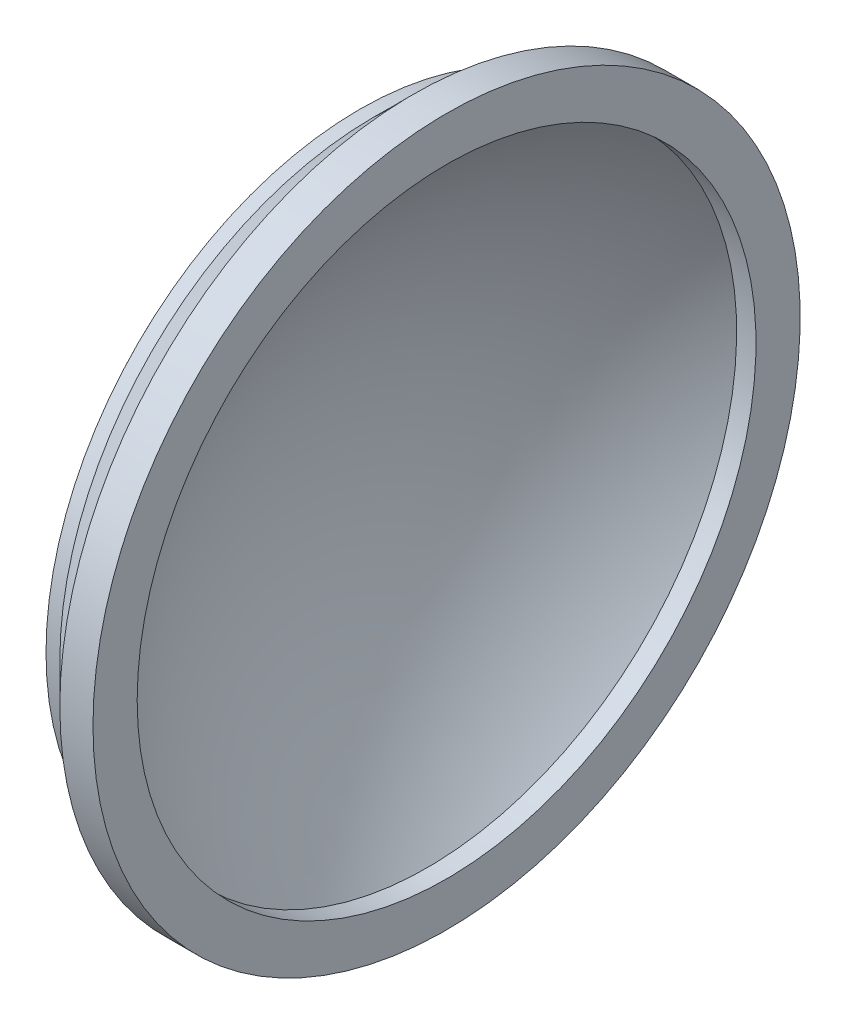
ISO-10303-21;
HEADER;
FILE_DESCRIPTION(('STEP AP214'),'2;1');
FILE_NAME('part.step','',(''),(''),'','','');
FILE_SCHEMA(('AUTOMOTIVE_DESIGN { 1 0 10303 214 1 1 1 1 }'));
ENDSEC;
DATA;
#1=APPLICATION_CONTEXT('core data for automotive mechanical design processes');
#2=APPLICATION_PROTOCOL_DEFINITION('international standard','automotive_design',2000,#1);
#3=PRODUCT_CONTEXT('',#1,'mechanical');
#4=PRODUCT('Part','Part','',(#3));
#5=PRODUCT_RELATED_PRODUCT_CATEGORY('part','',(#4));
#6=PRODUCT_DEFINITION_FORMATION('','',#4);
#7=PRODUCT_DEFINITION_CONTEXT('part definition',#1,'design');
#8=PRODUCT_DEFINITION('design','',#6,#7);
#9=PRODUCT_DEFINITION_SHAPE('','',#8);
#10=(LENGTH_UNIT() NAMED_UNIT(*) SI_UNIT(.MILLI.,.METRE.));
#11=(NAMED_UNIT(*) PLANE_ANGLE_UNIT() SI_UNIT($,.RADIAN.));
#12=(NAMED_UNIT(*) SI_UNIT($,.STERADIAN.) SOLID_ANGLE_UNIT());
#13=UNCERTAINTY_MEASURE_WITH_UNIT(LENGTH_MEASURE(1.E-05),#10,'distance_accuracy_value','');
#14=(GEOMETRIC_REPRESENTATION_CONTEXT(3) GLOBAL_UNCERTAINTY_ASSIGNED_CONTEXT((#13)) GLOBAL_UNIT_ASSIGNED_CONTEXT((#10,
#11,#12)) REPRESENTATION_CONTEXT('',''));
#15=CARTESIAN_POINT('',(0.,0.,0.));
#16=DIRECTION('',(0.,0.,1.));
#17=DIRECTION('',(1.,0.,0.));
#18=AXIS2_PLACEMENT_3D('',#15,#16,#17);
#19=CARTESIAN_POINT('',(44.4444055073609,0.,0.));
#20=DIRECTION('',(-1.,0.,0.));
#21=DIRECTION('',(0.,1.,0.));
#22=AXIS2_PLACEMENT_3D('',#19,#20,#21);
#23=SPHERICAL_SURFACE('',#22,95.);
#24=CARTESIAN_POINT('',(-31.7203851914246,0.,0.));
#25=DIRECTION('',(-1.,0.,0.));
#26=DIRECTION('',(0.,0.,1.));
#27=AXIS2_PLACEMENT_3D('',#24,#25,#26);
#28=CIRCLE('',#27,56.7796148085753);
#29=CARTESIAN_POINT('',(-31.7203851914246,0.,56.7796148085753));
#30=VERTEX_POINT('',#29);
#31=EDGE_CURVE('E68',#30,#30,#28,.T.);
#32=ORIENTED_EDGE('',*,*,#31,.T.);
#33=EDGE_LOOP('',(#32));
#34=FACE_BOUND('',#33,.T.);
#35=ADVANCED_FACE('F41',(#34),#23,.T.);
#36=CARTESIAN_POINT('',(44.4444055073609,0.,0.));
#37=DIRECTION('',(-1.,0.,0.));
#38=DIRECTION('',(0.,1.,0.));
#39=AXIS2_PLACEMENT_3D('',#36,#37,#38);
#40=SPHERICAL_SURFACE('',#39,85.);
#41=CARTESIAN_POINT('',(-19.5008836076317,0.,0.));
#42=DIRECTION('',(-1.,0.,0.));
#43=DIRECTION('',(0.,0.,1.));
#44=AXIS2_PLACEMENT_3D('',#41,#42,#43);
#45=CIRCLE('',#44,56.);
#46=CARTESIAN_POINT('',(-19.5008836076317,0.,56.));
#47=VERTEX_POINT('',#46);
#48=EDGE_CURVE('E10',#47,#47,#45,.T.);
#49=ORIENTED_EDGE('',*,*,#48,.F.);
#50=EDGE_LOOP('',(#49));
#51=FACE_BOUND('',#50,.T.);
#52=ADVANCED_FACE('F99',(#51),#40,.F.);
#53=CARTESIAN_POINT('',(-128.545758478018,0.,0.));
#54=DIRECTION('',(-1.,0.,0.));
#55=DIRECTION('',(0.,0.,1.));
#56=AXIS2_PLACEMENT_3D('',#53,#54,#55);
#57=CYLINDRICAL_SURFACE('',#56,56.);
#58=CARTESIAN_POINT('',(-16.,0.,0.));
#59=DIRECTION('',(-1.,0.,0.));
#60=DIRECTION('',(0.,0.,1.));
#61=AXIS2_PLACEMENT_3D('',#58,#59,#60);
#62=CIRCLE('',#61,56.);
#63=CARTESIAN_POINT('',(-16.,0.,56.));
#64=VERTEX_POINT('',#63);
#65=EDGE_CURVE('E48',#64,#64,#62,.T.);
#66=ORIENTED_EDGE('',*,*,#65,.F.);
#67=EDGE_LOOP('',(#66));
#68=FACE_BOUND('',#67,.T.);
#69=ORIENTED_EDGE('',*,*,#48,.T.);
#70=EDGE_LOOP('',(#69));
#71=FACE_BOUND('',#70,.T.);
#72=ADVANCED_FACE('F94',(#68,#71),#57,.F.);
#73=CARTESIAN_POINT('',(-16.,64.,0.));
#74=DIRECTION('',(-1.,0.,0.));
#75=DIRECTION('',(0.,0.,1.));
#76=AXIS2_PLACEMENT_3D('',#73,#74,#75);
#77=PLANE('',#76);
#78=CARTESIAN_POINT('',(-16.,0.,0.));
#79=DIRECTION('',(-1.,0.,0.));
#80=DIRECTION('',(0.,0.,1.));
#81=AXIS2_PLACEMENT_3D('',#78,#79,#80);
#82=CIRCLE('',#81,64.);
#83=CARTESIAN_POINT('',(-16.,0.,64.));
#84=VERTEX_POINT('',#83);
#85=EDGE_CURVE('E53',#84,#84,#82,.T.);
#86=ORIENTED_EDGE('',*,*,#85,.F.);
#87=EDGE_LOOP('',(#86));
#88=FACE_BOUND('',#87,.T.);
#89=ORIENTED_EDGE('',*,*,#65,.T.);
#90=EDGE_LOOP('',(#89));
#91=FACE_BOUND('',#90,.T.);
#92=ADVANCED_FACE('F89',(#88,#91),#77,.F.);
#93=CARTESIAN_POINT('',(-128.545758478018,0.,0.));
#94=DIRECTION('',(-1.,0.,0.));
#95=DIRECTION('',(0.,0.,1.));
#96=AXIS2_PLACEMENT_3D('',#93,#94,#95);
#97=CYLINDRICAL_SURFACE('',#96,64.);
#98=CARTESIAN_POINT('',(-22.,0.,0.));
#99=DIRECTION('',(-1.,0.,0.));
#100=DIRECTION('',(0.,0.,1.));
#101=AXIS2_PLACEMENT_3D('',#98,#99,#100);
#102=CIRCLE('',#101,64.);
#103=CARTESIAN_POINT('',(-22.,0.,64.));
#104=VERTEX_POINT('',#103);
#105=EDGE_CURVE('E58',#104,#104,#102,.T.);
#106=ORIENTED_EDGE('',*,*,#105,.F.);
#107=EDGE_LOOP('',(#106));
#108=FACE_BOUND('',#107,.T.);
#109=ORIENTED_EDGE('',*,*,#85,.T.);
#110=EDGE_LOOP('',(#109));
#111=FACE_BOUND('',#110,.T.);
#112=ADVANCED_FACE('F83',(#108,#111),#97,.T.);
#113=CARTESIAN_POINT('',(-22.,0.,0.));
#114=DIRECTION('',(1.,0.,0.));
#115=DIRECTION('',(0.,0.,-1.));
#116=AXIS2_PLACEMENT_3D('',#113,#114,#115);
#117=CONICAL_SURFACE('',#116,64.,0.78539816339745);
#118=CARTESIAN_POINT('',(-29.2203851914246,0.,0.));
#119=DIRECTION('',(-1.,0.,0.));
#120=DIRECTION('',(0.,0.,1.));
#121=AXIS2_PLACEMENT_3D('',#118,#119,#120);
#122=CIRCLE('',#121,56.7796148085753);
#123=CARTESIAN_POINT('',(-29.2203851914246,0.,56.7796148085753));
#124=VERTEX_POINT('',#123);
#125=EDGE_CURVE('E64',#124,#124,#122,.T.);
#126=ORIENTED_EDGE('',*,*,#125,.F.);
#127=EDGE_LOOP('',(#126));
#128=FACE_BOUND('',#127,.T.);
#129=ORIENTED_EDGE('',*,*,#105,.T.);
#130=EDGE_LOOP('',(#129));
#131=FACE_BOUND('',#130,.T.);
#132=ADVANCED_FACE('F77',(#128,#131),#117,.T.);
#133=CARTESIAN_POINT('',(-128.545758478018,0.,0.));
#134=DIRECTION('',(-1.,0.,0.));
#135=DIRECTION('',(0.,0.,1.));
#136=AXIS2_PLACEMENT_3D('',#133,#134,#135);
#137=CYLINDRICAL_SURFACE('',#136,56.7796148085753);
#138=ORIENTED_EDGE('',*,*,#31,.F.);
#139=EDGE_LOOP('',(#138));
#140=FACE_BOUND('',#139,.T.);
#141=ORIENTED_EDGE('',*,*,#125,.T.);
#142=EDGE_LOOP('',(#141));
#143=FACE_BOUND('',#142,.T.);
#144=ADVANCED_FACE('F74',(#140,#143),#137,.T.);
#145=CLOSED_SHELL('',(#35,#52,#72,#92,#112,#132,#144));
#146=MANIFOLD_SOLID_BREP('B2',#145);
#147=ADVANCED_BREP_SHAPE_REPRESENTATION('',(#18,#146),#14);
#148=SHAPE_DEFINITION_REPRESENTATION(#9,#147);
ENDSEC;
END-ISO-10303-21;
